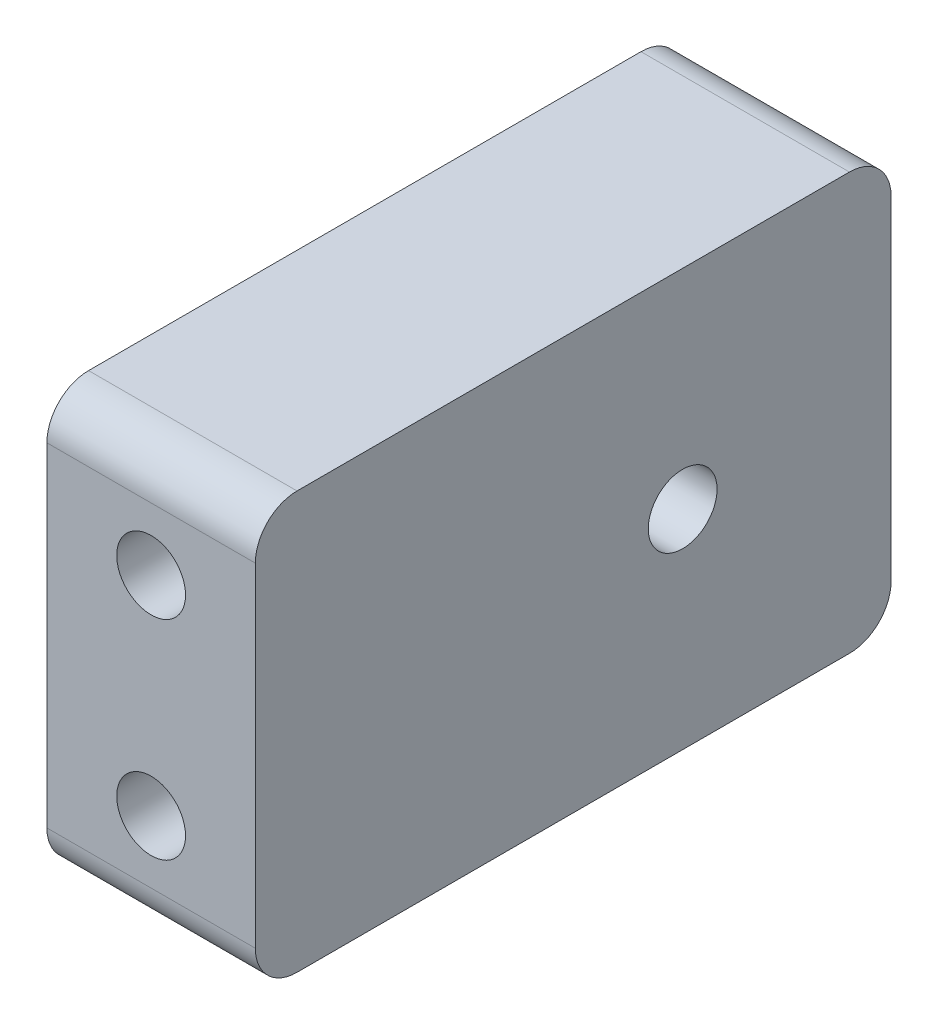
ISO-10303-21;
HEADER;
FILE_DESCRIPTION(('STEP AP214'),'2;1');
FILE_NAME('part.step','',(''),(''),'','','');
FILE_SCHEMA(('AUTOMOTIVE_DESIGN { 1 0 10303 214 1 1 1 1 }'));
ENDSEC;
DATA;
#1=APPLICATION_CONTEXT('core data for automotive mechanical design processes');
#2=APPLICATION_PROTOCOL_DEFINITION('international standard','automotive_design',2000,#1);
#3=PRODUCT_CONTEXT('',#1,'mechanical');
#4=PRODUCT('Part','Part','',(#3));
#5=PRODUCT_RELATED_PRODUCT_CATEGORY('part','',(#4));
#6=PRODUCT_DEFINITION_FORMATION('','',#4);
#7=PRODUCT_DEFINITION_CONTEXT('part definition',#1,'design');
#8=PRODUCT_DEFINITION('design','',#6,#7);
#9=PRODUCT_DEFINITION_SHAPE('','',#8);
#10=(LENGTH_UNIT() NAMED_UNIT(*) SI_UNIT(.MILLI.,.METRE.));
#11=(NAMED_UNIT(*) PLANE_ANGLE_UNIT() SI_UNIT($,.RADIAN.));
#12=(NAMED_UNIT(*) SI_UNIT($,.STERADIAN.) SOLID_ANGLE_UNIT());
#13=UNCERTAINTY_MEASURE_WITH_UNIT(LENGTH_MEASURE(1.E-05),#10,'distance_accuracy_value','');
#14=(GEOMETRIC_REPRESENTATION_CONTEXT(3) GLOBAL_UNCERTAINTY_ASSIGNED_CONTEXT((#13)) GLOBAL_UNIT_ASSIGNED_CONTEXT((#10,
#11,#12)) REPRESENTATION_CONTEXT('',''));
#15=CARTESIAN_POINT('',(0.,0.,0.));
#16=DIRECTION('',(0.,0.,1.));
#17=DIRECTION('',(1.,0.,0.));
#18=AXIS2_PLACEMENT_3D('',#15,#16,#17);
#19=CARTESIAN_POINT('',(10.,0.,0.));
#20=DIRECTION('',(-1.,0.,0.));
#21=DIRECTION('',(0.,0.,1.));
#22=AXIS2_PLACEMENT_3D('',#19,#20,#21);
#23=PLANE('',#22);
#24=DIRECTION('',(0.,0.,-1.));
#25=VECTOR('',#24,1.);
#26=CARTESIAN_POINT('',(10.,0.,0.));
#27=LINE('',#26,#25);
#28=CARTESIAN_POINT('',(10.,0.,-2.));
#29=VERTEX_POINT('',#28);
#30=CARTESIAN_POINT('',(10.,0.,-28.5));
#31=VERTEX_POINT('',#30);
#32=EDGE_CURVE('E134',#29,#31,#27,.T.);
#33=ORIENTED_EDGE('',*,*,#32,.T.);
#34=CARTESIAN_POINT('',(10.,2.,-28.5));
#35=DIRECTION('',(-1.,0.,0.));
#36=DIRECTION('',(0.,0.,1.));
#37=AXIS2_PLACEMENT_3D('',#34,#35,#36);
#38=CIRCLE('',#37,2.);
#39=CARTESIAN_POINT('',(10.,2.,-30.5));
#40=VERTEX_POINT('',#39);
#41=EDGE_CURVE('E174',#31,#40,#38,.F.);
#42=ORIENTED_EDGE('',*,*,#41,.T.);
#43=DIRECTION('',(0.,1.,0.));
#44=VECTOR('',#43,1.);
#45=CARTESIAN_POINT('',(10.,0.,-30.5));
#46=LINE('',#45,#44);
#47=CARTESIAN_POINT('',(10.,18.,-30.5));
#48=VERTEX_POINT('',#47);
#49=EDGE_CURVE('E138',#40,#48,#46,.T.);
#50=ORIENTED_EDGE('',*,*,#49,.T.);
#51=CARTESIAN_POINT('',(10.,18.,-28.5));
#52=DIRECTION('',(-1.,0.,0.));
#53=DIRECTION('',(0.,0.,1.));
#54=AXIS2_PLACEMENT_3D('',#51,#52,#53);
#55=CIRCLE('',#54,2.);
#56=CARTESIAN_POINT('',(10.,20.,-28.5));
#57=VERTEX_POINT('',#56);
#58=EDGE_CURVE('E55',#48,#57,#55,.F.);
#59=ORIENTED_EDGE('',*,*,#58,.T.);
#60=DIRECTION('',(0.,0.,1.));
#61=VECTOR('',#60,1.);
#62=CARTESIAN_POINT('',(10.,20.,0.));
#63=LINE('',#62,#61);
#64=CARTESIAN_POINT('',(10.,20.,-2.));
#65=VERTEX_POINT('',#64);
#66=EDGE_CURVE('E140',#57,#65,#63,.T.);
#67=ORIENTED_EDGE('',*,*,#66,.T.);
#68=CARTESIAN_POINT('',(10.,18.,-2.));
#69=DIRECTION('',(-1.,0.,0.));
#70=DIRECTION('',(0.,0.,1.));
#71=AXIS2_PLACEMENT_3D('',#68,#69,#70);
#72=CIRCLE('',#71,2.);
#73=CARTESIAN_POINT('',(10.,18.,0.));
#74=VERTEX_POINT('',#73);
#75=EDGE_CURVE('E169',#65,#74,#72,.F.);
#76=ORIENTED_EDGE('',*,*,#75,.T.);
#77=DIRECTION('',(0.,-1.,0.));
#78=VECTOR('',#77,1.);
#79=CARTESIAN_POINT('',(10.,0.,0.));
#80=LINE('',#79,#78);
#81=CARTESIAN_POINT('',(10.,2.,0.));
#82=VERTEX_POINT('',#81);
#83=EDGE_CURVE('E131',#74,#82,#80,.T.);
#84=ORIENTED_EDGE('',*,*,#83,.T.);
#85=CARTESIAN_POINT('',(10.,2.,-2.));
#86=DIRECTION('',(-1.,0.,0.));
#87=DIRECTION('',(0.,0.,1.));
#88=AXIS2_PLACEMENT_3D('',#85,#86,#87);
#89=CIRCLE('',#88,2.);
#90=EDGE_CURVE('E171',#82,#29,#89,.F.);
#91=ORIENTED_EDGE('',*,*,#90,.T.);
#92=EDGE_LOOP('',(#33,#42,#50,#59,#67,#76,#84,#91));
#93=FACE_BOUND('',#92,.T.);
#94=CARTESIAN_POINT('',(10.,10.,-20.5));
#95=DIRECTION('',(1.,0.,0.));
#96=DIRECTION('',(0.,0.,-1.));
#97=AXIS2_PLACEMENT_3D('',#94,#95,#96);
#98=CIRCLE('',#97,1.65);
#99=CARTESIAN_POINT('',(10.,10.,-22.15));
#100=VERTEX_POINT('',#99);
#101=EDGE_CURVE('E125',#100,#100,#98,.T.);
#102=ORIENTED_EDGE('',*,*,#101,.F.);
#103=EDGE_LOOP('',(#102));
#104=FACE_BOUND('',#103,.T.);
#105=ADVANCED_FACE('F33',(#93,#104),#23,.F.);
#106=CARTESIAN_POINT('',(0.,0.,0.));
#107=DIRECTION('',(-1.,0.,0.));
#108=DIRECTION('',(0.,0.,1.));
#109=AXIS2_PLACEMENT_3D('',#106,#107,#108);
#110=PLANE('',#109);
#111=DIRECTION('',(0.,1.,0.));
#112=VECTOR('',#111,1.);
#113=CARTESIAN_POINT('',(0.,0.,-30.5));
#114=LINE('',#113,#112);
#115=CARTESIAN_POINT('',(0.,2.,-30.5));
#116=VERTEX_POINT('',#115);
#117=CARTESIAN_POINT('',(0.,18.,-30.5));
#118=VERTEX_POINT('',#117);
#119=EDGE_CURVE('E148',#116,#118,#114,.T.);
#120=ORIENTED_EDGE('',*,*,#119,.F.);
#121=CARTESIAN_POINT('',(0.,2.,-28.5));
#122=DIRECTION('',(-1.,0.,0.));
#123=DIRECTION('',(0.,0.,1.));
#124=AXIS2_PLACEMENT_3D('',#121,#122,#123);
#125=CIRCLE('',#124,2.);
#126=CARTESIAN_POINT('',(0.,0.,-28.5));
#127=VERTEX_POINT('',#126);
#128=EDGE_CURVE('E162',#116,#127,#125,.T.);
#129=ORIENTED_EDGE('',*,*,#128,.T.);
#130=DIRECTION('',(0.,0.,-1.));
#131=VECTOR('',#130,1.);
#132=CARTESIAN_POINT('',(0.,0.,0.));
#133=LINE('',#132,#131);
#134=CARTESIAN_POINT('',(0.,0.,-2.));
#135=VERTEX_POINT('',#134);
#136=EDGE_CURVE('E145',#135,#127,#133,.T.);
#137=ORIENTED_EDGE('',*,*,#136,.F.);
#138=CARTESIAN_POINT('',(0.,2.,-2.));
#139=DIRECTION('',(-1.,0.,0.));
#140=DIRECTION('',(0.,0.,1.));
#141=AXIS2_PLACEMENT_3D('',#138,#139,#140);
#142=CIRCLE('',#141,2.);
#143=CARTESIAN_POINT('',(0.,2.,0.));
#144=VERTEX_POINT('',#143);
#145=EDGE_CURVE('E158',#135,#144,#142,.T.);
#146=ORIENTED_EDGE('',*,*,#145,.T.);
#147=DIRECTION('',(0.,-1.,0.));
#148=VECTOR('',#147,1.);
#149=CARTESIAN_POINT('',(0.,0.,0.));
#150=LINE('',#149,#148);
#151=CARTESIAN_POINT('',(0.,18.,0.));
#152=VERTEX_POINT('',#151);
#153=EDGE_CURVE('E128',#152,#144,#150,.T.);
#154=ORIENTED_EDGE('',*,*,#153,.F.);
#155=CARTESIAN_POINT('',(0.,18.,-2.));
#156=DIRECTION('',(-1.,0.,0.));
#157=DIRECTION('',(0.,0.,1.));
#158=AXIS2_PLACEMENT_3D('',#155,#156,#157);
#159=CIRCLE('',#158,2.);
#160=CARTESIAN_POINT('',(0.,20.,-2.));
#161=VERTEX_POINT('',#160);
#162=EDGE_CURVE('E156',#152,#161,#159,.T.);
#163=ORIENTED_EDGE('',*,*,#162,.T.);
#164=DIRECTION('',(0.,0.,1.));
#165=VECTOR('',#164,1.);
#166=CARTESIAN_POINT('',(0.,20.,0.));
#167=LINE('',#166,#165);
#168=CARTESIAN_POINT('',(0.,20.,-28.5));
#169=VERTEX_POINT('',#168);
#170=EDGE_CURVE('E135',#169,#161,#167,.T.);
#171=ORIENTED_EDGE('',*,*,#170,.F.);
#172=CARTESIAN_POINT('',(0.,18.,-28.5));
#173=DIRECTION('',(-1.,0.,0.));
#174=DIRECTION('',(0.,0.,1.));
#175=AXIS2_PLACEMENT_3D('',#172,#173,#174);
#176=CIRCLE('',#175,2.);
#177=EDGE_CURVE('E160',#169,#118,#176,.T.);
#178=ORIENTED_EDGE('',*,*,#177,.T.);
#179=EDGE_LOOP('',(#120,#129,#137,#146,#154,#163,#171,#178));
#180=FACE_BOUND('',#179,.T.);
#181=CARTESIAN_POINT('',(0.,10.,-20.5));
#182=DIRECTION('',(1.,0.,0.));
#183=DIRECTION('',(0.,0.,-1.));
#184=AXIS2_PLACEMENT_3D('',#181,#182,#183);
#185=CIRCLE('',#184,1.65);
#186=CARTESIAN_POINT('',(0.,10.,-22.15));
#187=VERTEX_POINT('',#186);
#188=EDGE_CURVE('E124',#187,#187,#185,.T.);
#189=ORIENTED_EDGE('',*,*,#188,.T.);
#190=EDGE_LOOP('',(#189));
#191=FACE_BOUND('',#190,.T.);
#192=ADVANCED_FACE('F190',(#180,#191),#110,.T.);
#193=CARTESIAN_POINT('',(10.,0.,0.));
#194=DIRECTION('',(0.,0.,-1.));
#195=DIRECTION('',(-1.,0.,0.));
#196=AXIS2_PLACEMENT_3D('',#193,#194,#195);
#197=PLANE('',#196);
#198=CARTESIAN_POINT('',(5.,15.,0.));
#199=DIRECTION('',(0.,0.,1.));
#200=DIRECTION('',(1.,0.,0.));
#201=AXIS2_PLACEMENT_3D('',#198,#199,#200);
#202=CIRCLE('',#201,1.64999999999999);
#203=CARTESIAN_POINT('',(6.64999999999999,15.,0.));
#204=VERTEX_POINT('',#203);
#205=EDGE_CURVE('E114',#204,#204,#202,.T.);
#206=ORIENTED_EDGE('',*,*,#205,.F.);
#207=EDGE_LOOP('',(#206));
#208=FACE_BOUND('',#207,.T.);
#209=CARTESIAN_POINT('',(5.,5.,0.));
#210=DIRECTION('',(0.,0.,1.));
#211=DIRECTION('',(1.,0.,0.));
#212=AXIS2_PLACEMENT_3D('',#209,#210,#211);
#213=CIRCLE('',#212,1.64999999999999);
#214=CARTESIAN_POINT('',(6.64999999999999,5.,0.));
#215=VERTEX_POINT('',#214);
#216=EDGE_CURVE('E113',#215,#215,#213,.T.);
#217=ORIENTED_EDGE('',*,*,#216,.F.);
#218=EDGE_LOOP('',(#217));
#219=FACE_BOUND('',#218,.T.);
#220=ORIENTED_EDGE('',*,*,#153,.T.);
#221=DIRECTION('',(-1.,0.,0.));
#222=VECTOR('',#221,1.);
#223=CARTESIAN_POINT('',(10.,2.,0.));
#224=LINE('',#223,#222);
#225=EDGE_CURVE('E11',#144,#82,#224,.F.);
#226=ORIENTED_EDGE('',*,*,#225,.T.);
#227=ORIENTED_EDGE('',*,*,#83,.F.);
#228=DIRECTION('',(-1.,0.,0.));
#229=VECTOR('',#228,1.);
#230=CARTESIAN_POINT('',(10.,18.,0.));
#231=LINE('',#230,#229);
#232=EDGE_CURVE('E41',#74,#152,#231,.T.);
#233=ORIENTED_EDGE('',*,*,#232,.T.);
#234=EDGE_LOOP('',(#220,#226,#227,#233));
#235=FACE_BOUND('',#234,.T.);
#236=ADVANCED_FACE('F184',(#208,#219,#235),#197,.F.);
#237=CARTESIAN_POINT('',(10.,0.,0.));
#238=DIRECTION('',(0.,1.,0.));
#239=DIRECTION('',(0.,0.,1.));
#240=AXIS2_PLACEMENT_3D('',#237,#238,#239);
#241=PLANE('',#240);
#242=ORIENTED_EDGE('',*,*,#136,.T.);
#243=DIRECTION('',(-1.,0.,0.));
#244=VECTOR('',#243,1.);
#245=CARTESIAN_POINT('',(10.,0.,-28.5));
#246=LINE('',#245,#244);
#247=EDGE_CURVE('E167',#127,#31,#246,.F.);
#248=ORIENTED_EDGE('',*,*,#247,.T.);
#249=ORIENTED_EDGE('',*,*,#32,.F.);
#250=DIRECTION('',(-1.,0.,0.));
#251=VECTOR('',#250,1.);
#252=CARTESIAN_POINT('',(10.,0.,-2.));
#253=LINE('',#252,#251);
#254=EDGE_CURVE('E164',#29,#135,#253,.T.);
#255=ORIENTED_EDGE('',*,*,#254,.T.);
#256=EDGE_LOOP('',(#242,#248,#249,#255));
#257=FACE_BOUND('',#256,.T.);
#258=ADVANCED_FACE('F200',(#257),#241,.F.);
#259=CARTESIAN_POINT('',(10.,0.,-30.5));
#260=DIRECTION('',(0.,0.,1.));
#261=DIRECTION('',(1.,0.,0.));
#262=AXIS2_PLACEMENT_3D('',#259,#260,#261);
#263=PLANE('',#262);
#264=ORIENTED_EDGE('',*,*,#49,.F.);
#265=DIRECTION('',(-1.,0.,0.));
#266=VECTOR('',#265,1.);
#267=CARTESIAN_POINT('',(10.,2.,-30.5));
#268=LINE('',#267,#266);
#269=EDGE_CURVE('E153',#40,#116,#268,.T.);
#270=ORIENTED_EDGE('',*,*,#269,.T.);
#271=ORIENTED_EDGE('',*,*,#119,.T.);
#272=DIRECTION('',(-1.,0.,0.));
#273=VECTOR('',#272,1.);
#274=CARTESIAN_POINT('',(10.,18.,-30.5));
#275=LINE('',#274,#273);
#276=EDGE_CURVE('E142',#118,#48,#275,.F.);
#277=ORIENTED_EDGE('',*,*,#276,.T.);
#278=EDGE_LOOP('',(#264,#270,#271,#277));
#279=FACE_BOUND('',#278,.T.);
#280=ADVANCED_FACE('F209',(#279),#263,.F.);
#281=CARTESIAN_POINT('',(10.,20.,0.));
#282=DIRECTION('',(0.,-1.,0.));
#283=DIRECTION('',(0.,0.,-1.));
#284=AXIS2_PLACEMENT_3D('',#281,#282,#283);
#285=PLANE('',#284);
#286=ORIENTED_EDGE('',*,*,#66,.F.);
#287=DIRECTION('',(-1.,0.,0.));
#288=VECTOR('',#287,1.);
#289=CARTESIAN_POINT('',(10.,20.,-28.5));
#290=LINE('',#289,#288);
#291=EDGE_CURVE('E177',#57,#169,#290,.T.);
#292=ORIENTED_EDGE('',*,*,#291,.T.);
#293=ORIENTED_EDGE('',*,*,#170,.T.);
#294=DIRECTION('',(-1.,0.,0.));
#295=VECTOR('',#294,1.);
#296=CARTESIAN_POINT('',(10.,20.,-2.));
#297=LINE('',#296,#295);
#298=EDGE_CURVE('E48',#161,#65,#297,.F.);
#299=ORIENTED_EDGE('',*,*,#298,.T.);
#300=EDGE_LOOP('',(#286,#292,#293,#299));
#301=FACE_BOUND('',#300,.T.);
#302=ADVANCED_FACE('F214',(#301),#285,.F.);
#303=CARTESIAN_POINT('',(10.,10.,-20.5));
#304=DIRECTION('',(-1.,0.,0.));
#305=DIRECTION('',(0.,0.,1.));
#306=AXIS2_PLACEMENT_3D('',#303,#304,#305);
#307=CYLINDRICAL_SURFACE('',#306,1.65);
#308=ORIENTED_EDGE('',*,*,#101,.T.);
#309=EDGE_LOOP('',(#308));
#310=FACE_BOUND('',#309,.T.);
#311=ORIENTED_EDGE('',*,*,#188,.F.);
#312=EDGE_LOOP('',(#311));
#313=FACE_BOUND('',#312,.T.);
#314=ADVANCED_FACE('F226',(#310,#313),#307,.F.);
#315=CARTESIAN_POINT('',(5.,5.,-15.));
#316=DIRECTION('',(0.,0.,1.));
#317=DIRECTION('',(1.,0.,0.));
#318=AXIS2_PLACEMENT_3D('',#315,#316,#317);
#319=CONICAL_SURFACE('',#318,1.64999999999999,1.02974425867665);
#320=CARTESIAN_POINT('',(5.,5.,-15.9914200213955));
#321=VERTEX_POINT('',#320);
#322=VERTEX_LOOP('',#321);
#323=FACE_BOUND('',#322,.T.);
#324=CARTESIAN_POINT('',(5.,5.,-15.));
#325=DIRECTION('',(0.,0.,1.));
#326=DIRECTION('',(1.,0.,0.));
#327=AXIS2_PLACEMENT_3D('',#324,#325,#326);
#328=CIRCLE('',#327,1.64999999999999);
#329=CARTESIAN_POINT('',(6.64999999999999,5.,-15.));
#330=VERTEX_POINT('',#329);
#331=EDGE_CURVE('E117',#330,#330,#328,.T.);
#332=ORIENTED_EDGE('',*,*,#331,.T.);
#333=EDGE_LOOP('',(#332));
#334=FACE_BOUND('',#333,.T.);
#335=ADVANCED_FACE('F282',(#323,#334),#319,.F.);
#336=CARTESIAN_POINT('',(5.,5.,0.));
#337=DIRECTION('',(0.,0.,1.));
#338=DIRECTION('',(1.,0.,0.));
#339=AXIS2_PLACEMENT_3D('',#336,#337,#338);
#340=CYLINDRICAL_SURFACE('',#339,1.64999999999999);
#341=ORIENTED_EDGE('',*,*,#331,.F.);
#342=EDGE_LOOP('',(#341));
#343=FACE_BOUND('',#342,.T.);
#344=ORIENTED_EDGE('',*,*,#216,.T.);
#345=EDGE_LOOP('',(#344));
#346=FACE_BOUND('',#345,.T.);
#347=ADVANCED_FACE('F107',(#343,#346),#340,.F.);
#348=CARTESIAN_POINT('',(5.,15.,-15.));
#349=DIRECTION('',(0.,0.,1.));
#350=DIRECTION('',(1.,0.,0.));
#351=AXIS2_PLACEMENT_3D('',#348,#349,#350);
#352=CONICAL_SURFACE('',#351,1.64999999999999,1.02974425867665);
#353=CARTESIAN_POINT('',(5.,15.,-15.9914200213955));
#354=VERTEX_POINT('',#353);
#355=VERTEX_LOOP('',#354);
#356=FACE_BOUND('',#355,.T.);
#357=CARTESIAN_POINT('',(5.,15.,-15.));
#358=DIRECTION('',(0.,0.,1.));
#359=DIRECTION('',(1.,0.,0.));
#360=AXIS2_PLACEMENT_3D('',#357,#358,#359);
#361=CIRCLE('',#360,1.64999999999999);
#362=CARTESIAN_POINT('',(6.64999999999999,15.,-15.));
#363=VERTEX_POINT('',#362);
#364=EDGE_CURVE('E111',#363,#363,#361,.T.);
#365=ORIENTED_EDGE('',*,*,#364,.T.);
#366=EDGE_LOOP('',(#365));
#367=FACE_BOUND('',#366,.T.);
#368=ADVANCED_FACE('F103',(#356,#367),#352,.F.);
#369=CARTESIAN_POINT('',(5.,15.,0.));
#370=DIRECTION('',(0.,0.,1.));
#371=DIRECTION('',(1.,0.,0.));
#372=AXIS2_PLACEMENT_3D('',#369,#370,#371);
#373=CYLINDRICAL_SURFACE('',#372,1.64999999999999);
#374=ORIENTED_EDGE('',*,*,#364,.F.);
#375=EDGE_LOOP('',(#374));
#376=FACE_BOUND('',#375,.T.);
#377=ORIENTED_EDGE('',*,*,#205,.T.);
#378=EDGE_LOOP('',(#377));
#379=FACE_BOUND('',#378,.T.);
#380=ADVANCED_FACE('F106',(#376,#379),#373,.F.);
#381=CARTESIAN_POINT('',(10.,2.,-28.5));
#382=DIRECTION('',(-1.,0.,0.));
#383=DIRECTION('',(0.,0.,1.));
#384=AXIS2_PLACEMENT_3D('',#381,#382,#383);
#385=CYLINDRICAL_SURFACE('',#384,2.);
#386=ORIENTED_EDGE('',*,*,#41,.F.);
#387=ORIENTED_EDGE('',*,*,#247,.F.);
#388=ORIENTED_EDGE('',*,*,#128,.F.);
#389=ORIENTED_EDGE('',*,*,#269,.F.);
#390=EDGE_LOOP('',(#386,#387,#388,#389));
#391=FACE_BOUND('',#390,.T.);
#392=ADVANCED_FACE('F207',(#391),#385,.T.);
#393=CARTESIAN_POINT('',(10.,18.,-28.5));
#394=DIRECTION('',(-1.,0.,0.));
#395=DIRECTION('',(0.,0.,1.));
#396=AXIS2_PLACEMENT_3D('',#393,#394,#395);
#397=CYLINDRICAL_SURFACE('',#396,2.);
#398=ORIENTED_EDGE('',*,*,#58,.F.);
#399=ORIENTED_EDGE('',*,*,#276,.F.);
#400=ORIENTED_EDGE('',*,*,#177,.F.);
#401=ORIENTED_EDGE('',*,*,#291,.F.);
#402=EDGE_LOOP('',(#398,#399,#400,#401));
#403=FACE_BOUND('',#402,.T.);
#404=ADVANCED_FACE('F213',(#403),#397,.T.);
#405=CARTESIAN_POINT('',(10.,2.,-2.));
#406=DIRECTION('',(-1.,0.,0.));
#407=DIRECTION('',(0.,0.,1.));
#408=AXIS2_PLACEMENT_3D('',#405,#406,#407);
#409=CYLINDRICAL_SURFACE('',#408,2.);
#410=ORIENTED_EDGE('',*,*,#90,.F.);
#411=ORIENTED_EDGE('',*,*,#225,.F.);
#412=ORIENTED_EDGE('',*,*,#145,.F.);
#413=ORIENTED_EDGE('',*,*,#254,.F.);
#414=EDGE_LOOP('',(#410,#411,#412,#413));
#415=FACE_BOUND('',#414,.T.);
#416=ADVANCED_FACE('F197',(#415),#409,.T.);
#417=CARTESIAN_POINT('',(10.,18.,-2.));
#418=DIRECTION('',(-1.,0.,0.));
#419=DIRECTION('',(0.,0.,1.));
#420=AXIS2_PLACEMENT_3D('',#417,#418,#419);
#421=CYLINDRICAL_SURFACE('',#420,2.);
#422=ORIENTED_EDGE('',*,*,#75,.F.);
#423=ORIENTED_EDGE('',*,*,#298,.F.);
#424=ORIENTED_EDGE('',*,*,#162,.F.);
#425=ORIENTED_EDGE('',*,*,#232,.F.);
#426=EDGE_LOOP('',(#422,#423,#424,#425));
#427=FACE_BOUND('',#426,.T.);
#428=ADVANCED_FACE('F35',(#427),#421,.T.);
#429=CLOSED_SHELL('',(#105,#192,#236,#258,#280,#302,#314,#335,#347,#368,#380,#392,#404,#416,#428));
#430=MANIFOLD_SOLID_BREP('B2',#429);
#431=ADVANCED_BREP_SHAPE_REPRESENTATION('',(#18,#430),#14);
#432=SHAPE_DEFINITION_REPRESENTATION(#9,#431);
ENDSEC;
END-ISO-10303-21;
